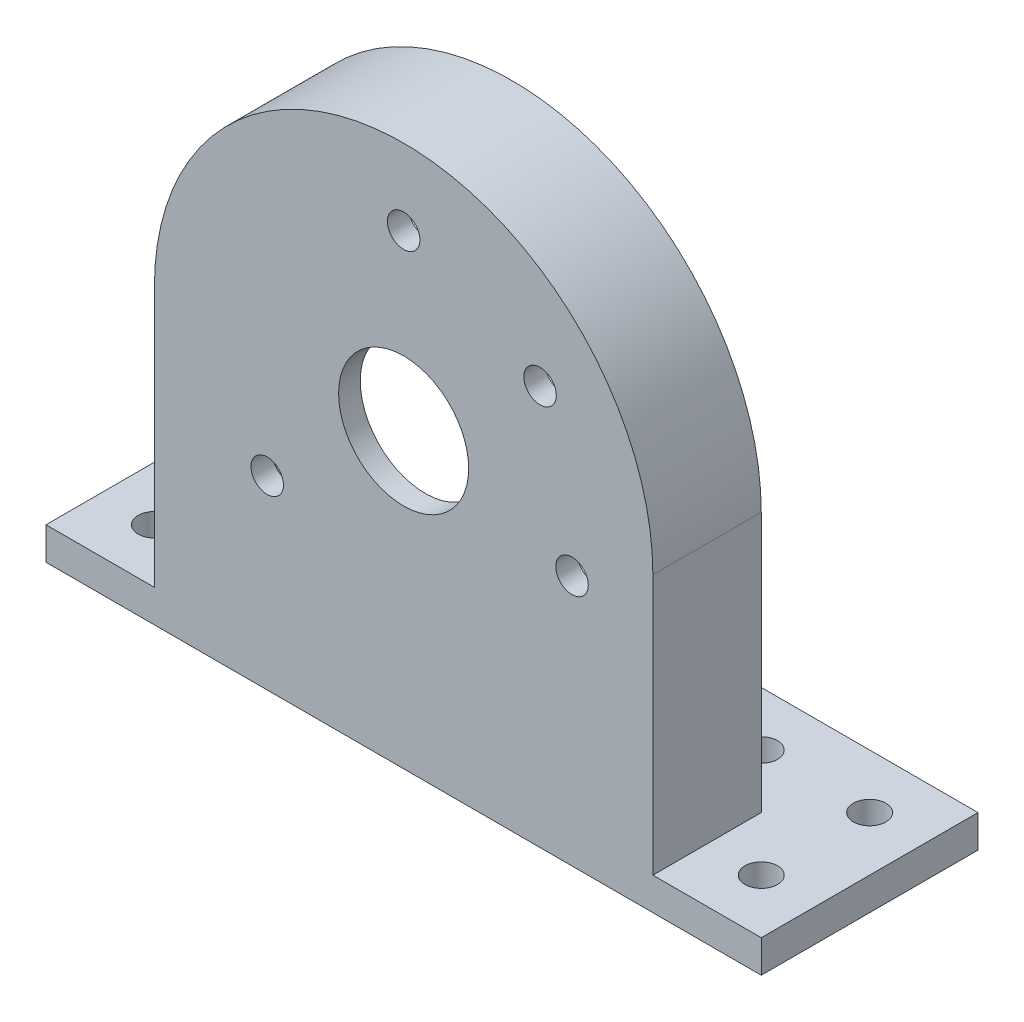
ISO-10303-21;
HEADER;
FILE_DESCRIPTION(('STEP AP214'),'2;1');
FILE_NAME('part.step','',(''),(''),'','','');
FILE_SCHEMA(('AUTOMOTIVE_DESIGN { 1 0 10303 214 1 1 1 1 }'));
ENDSEC;
DATA;
#1=APPLICATION_CONTEXT('core data for automotive mechanical design processes');
#2=APPLICATION_PROTOCOL_DEFINITION('international standard','automotive_design',2000,#1);
#3=PRODUCT_CONTEXT('',#1,'mechanical');
#4=PRODUCT('Part','Part','',(#3));
#5=PRODUCT_RELATED_PRODUCT_CATEGORY('part','',(#4));
#6=PRODUCT_DEFINITION_FORMATION('','',#4);
#7=PRODUCT_DEFINITION_CONTEXT('part definition',#1,'design');
#8=PRODUCT_DEFINITION('design','',#6,#7);
#9=PRODUCT_DEFINITION_SHAPE('','',#8);
#10=(LENGTH_UNIT() NAMED_UNIT(*) SI_UNIT(.MILLI.,.METRE.));
#11=(NAMED_UNIT(*) PLANE_ANGLE_UNIT() SI_UNIT($,.RADIAN.));
#12=(NAMED_UNIT(*) SI_UNIT($,.STERADIAN.) SOLID_ANGLE_UNIT());
#13=UNCERTAINTY_MEASURE_WITH_UNIT(LENGTH_MEASURE(1.E-05),#10,'distance_accuracy_value','');
#14=(GEOMETRIC_REPRESENTATION_CONTEXT(3) GLOBAL_UNCERTAINTY_ASSIGNED_CONTEXT((#13)) GLOBAL_UNIT_ASSIGNED_CONTEXT((#10,
#11,#12)) REPRESENTATION_CONTEXT('',''));
#15=CARTESIAN_POINT('',(0.,0.,0.));
#16=DIRECTION('',(0.,0.,1.));
#17=DIRECTION('',(1.,0.,0.));
#18=AXIS2_PLACEMENT_3D('',#15,#16,#17);
#19=CARTESIAN_POINT('',(-23.,0.,20.));
#20=DIRECTION('',(1.,0.,0.));
#21=DIRECTION('',(0.,1.,0.));
#22=AXIS2_PLACEMENT_3D('',#19,#20,#21);
#23=PLANE('',#22);
#24=DIRECTION('',(0.,0.,1.));
#25=VECTOR('',#24,1.);
#26=CARTESIAN_POINT('',(-23.,-24.,20.));
#27=LINE('',#26,#25);
#28=CARTESIAN_POINT('',(-23.,-24.,10.));
#29=VERTEX_POINT('',#28);
#30=CARTESIAN_POINT('',(-23.,-24.,20.));
#31=VERTEX_POINT('',#30);
#32=EDGE_CURVE('E54',#29,#31,#27,.T.);
#33=ORIENTED_EDGE('',*,*,#32,.T.);
#34=DIRECTION('',(0.,-1.,0.));
#35=VECTOR('',#34,1.);
#36=CARTESIAN_POINT('',(-23.,0.,20.));
#37=LINE('',#36,#35);
#38=CARTESIAN_POINT('',(-23.,0.,20.));
#39=VERTEX_POINT('',#38);
#40=EDGE_CURVE('E128',#39,#31,#37,.T.);
#41=ORIENTED_EDGE('',*,*,#40,.F.);
#42=DIRECTION('',(0.,0.,-1.));
#43=VECTOR('',#42,1.);
#44=CARTESIAN_POINT('',(-23.,0.,20.));
#45=LINE('',#44,#43);
#46=CARTESIAN_POINT('',(-23.,0.,10.));
#47=VERTEX_POINT('',#46);
#48=EDGE_CURVE('E11',#39,#47,#45,.T.);
#49=ORIENTED_EDGE('',*,*,#48,.T.);
#50=DIRECTION('',(0.,1.,0.));
#51=VECTOR('',#50,1.);
#52=CARTESIAN_POINT('',(-23.,-24.,10.));
#53=LINE('',#52,#51);
#54=EDGE_CURVE('E216',#29,#47,#53,.T.);
#55=ORIENTED_EDGE('',*,*,#54,.F.);
#56=EDGE_LOOP('',(#33,#41,#49,#55));
#57=FACE_BOUND('',#56,.T.);
#58=ADVANCED_FACE('F37',(#57),#23,.F.);
#59=CARTESIAN_POINT('',(23.,-27.,20.));
#60=DIRECTION('',(-1.,0.,0.));
#61=DIRECTION('',(0.,-1.,0.));
#62=AXIS2_PLACEMENT_3D('',#59,#60,#61);
#63=PLANE('',#62);
#64=DIRECTION('',(0.,0.,-1.));
#65=VECTOR('',#64,1.);
#66=CARTESIAN_POINT('',(23.,-24.,20.));
#67=LINE('',#66,#65);
#68=CARTESIAN_POINT('',(23.,-24.,20.));
#69=VERTEX_POINT('',#68);
#70=CARTESIAN_POINT('',(23.,-24.,10.));
#71=VERTEX_POINT('',#70);
#72=EDGE_CURVE('E151',#69,#71,#67,.T.);
#73=ORIENTED_EDGE('',*,*,#72,.T.);
#74=DIRECTION('',(0.,-1.,0.));
#75=VECTOR('',#74,1.);
#76=CARTESIAN_POINT('',(23.,0.,10.));
#77=LINE('',#76,#75);
#78=CARTESIAN_POINT('',(23.,0.,10.));
#79=VERTEX_POINT('',#78);
#80=EDGE_CURVE('E211',#79,#71,#77,.T.);
#81=ORIENTED_EDGE('',*,*,#80,.F.);
#82=DIRECTION('',(0.,0.,-1.));
#83=VECTOR('',#82,1.);
#84=CARTESIAN_POINT('',(23.,0.,20.));
#85=LINE('',#84,#83);
#86=CARTESIAN_POINT('',(23.,0.,20.));
#87=VERTEX_POINT('',#86);
#88=EDGE_CURVE('E46',#87,#79,#85,.T.);
#89=ORIENTED_EDGE('',*,*,#88,.F.);
#90=DIRECTION('',(0.,1.,0.));
#91=VECTOR('',#90,1.);
#92=CARTESIAN_POINT('',(23.,-27.,20.));
#93=LINE('',#92,#91);
#94=EDGE_CURVE('E62',#69,#87,#93,.T.);
#95=ORIENTED_EDGE('',*,*,#94,.F.);
#96=EDGE_LOOP('',(#73,#81,#89,#95));
#97=FACE_BOUND('',#96,.T.);
#98=ADVANCED_FACE('F276',(#97),#63,.F.);
#99=CARTESIAN_POINT('',(0.,0.,20.));
#100=DIRECTION('',(0.,0.,-1.));
#101=DIRECTION('',(-1.,0.,0.));
#102=AXIS2_PLACEMENT_3D('',#99,#100,#101);
#103=CYLINDRICAL_SURFACE('',#102,23.);
#104=CARTESIAN_POINT('',(0.,0.,10.));
#105=DIRECTION('',(0.,0.,-1.));
#106=DIRECTION('',(-1.,0.,0.));
#107=AXIS2_PLACEMENT_3D('',#104,#105,#106);
#108=CIRCLE('',#107,23.);
#109=EDGE_CURVE('E218',#47,#79,#108,.T.);
#110=ORIENTED_EDGE('',*,*,#109,.F.);
#111=ORIENTED_EDGE('',*,*,#48,.F.);
#112=CARTESIAN_POINT('',(0.,0.,20.));
#113=DIRECTION('',(0.,0.,1.));
#114=DIRECTION('',(1.,0.,0.));
#115=AXIS2_PLACEMENT_3D('',#112,#113,#114);
#116=CIRCLE('',#115,23.);
#117=EDGE_CURVE('E222',#87,#39,#116,.T.);
#118=ORIENTED_EDGE('',*,*,#117,.F.);
#119=ORIENTED_EDGE('',*,*,#88,.T.);
#120=EDGE_LOOP('',(#110,#111,#118,#119));
#121=FACE_BOUND('',#120,.T.);
#122=ADVANCED_FACE('F39',(#121),#103,.T.);
#123=CARTESIAN_POINT('',(-23.,-27.,20.));
#124=DIRECTION('',(0.,1.,0.));
#125=DIRECTION('',(0.,0.,1.));
#126=AXIS2_PLACEMENT_3D('',#123,#124,#125);
#127=PLANE('',#126);
#128=CARTESIAN_POINT('',(-18.,-27.,5.));
#129=DIRECTION('',(0.,-1.,0.));
#130=DIRECTION('',(0.,0.,1.));
#131=AXIS2_PLACEMENT_3D('',#128,#129,#130);
#132=CIRCLE('',#131,1.5);
#133=CARTESIAN_POINT('',(-18.,-27.,6.5));
#134=VERTEX_POINT('',#133);
#135=EDGE_CURVE('E195',#134,#134,#132,.T.);
#136=ORIENTED_EDGE('',*,*,#135,.F.);
#137=EDGE_LOOP('',(#136));
#138=FACE_BOUND('',#137,.T.);
#139=CARTESIAN_POINT('',(18.,-27.,5.));
#140=DIRECTION('',(0.,-1.,0.));
#141=DIRECTION('',(0.,0.,-1.));
#142=AXIS2_PLACEMENT_3D('',#139,#140,#141);
#143=CIRCLE('',#142,1.5);
#144=CARTESIAN_POINT('',(18.,-27.,3.5));
#145=VERTEX_POINT('',#144);
#146=EDGE_CURVE('E192',#145,#145,#143,.T.);
#147=ORIENTED_EDGE('',*,*,#146,.F.);
#148=EDGE_LOOP('',(#147));
#149=FACE_BOUND('',#148,.T.);
#150=CARTESIAN_POINT('',(18.,-27.,15.));
#151=DIRECTION('',(0.,-1.,0.));
#152=DIRECTION('',(0.,0.,1.));
#153=AXIS2_PLACEMENT_3D('',#150,#151,#152);
#154=CIRCLE('',#153,1.5);
#155=CARTESIAN_POINT('',(18.,-27.,16.5));
#156=VERTEX_POINT('',#155);
#157=EDGE_CURVE('E189',#156,#156,#154,.T.);
#158=ORIENTED_EDGE('',*,*,#157,.F.);
#159=EDGE_LOOP('',(#158));
#160=FACE_BOUND('',#159,.T.);
#161=CARTESIAN_POINT('',(-18.,-27.,15.));
#162=DIRECTION('',(0.,-1.,0.));
#163=DIRECTION('',(0.,0.,-1.));
#164=AXIS2_PLACEMENT_3D('',#161,#162,#163);
#165=CIRCLE('',#164,1.5);
#166=CARTESIAN_POINT('',(-18.,-27.,13.5));
#167=VERTEX_POINT('',#166);
#168=EDGE_CURVE('E188',#167,#167,#165,.T.);
#169=ORIENTED_EDGE('',*,*,#168,.F.);
#170=EDGE_LOOP('',(#169));
#171=FACE_BOUND('',#170,.T.);
#172=DIRECTION('',(1.,0.,0.));
#173=VECTOR('',#172,1.);
#174=CARTESIAN_POINT('',(-23.,-27.,0.));
#175=LINE('',#174,#173);
#176=CARTESIAN_POINT('',(-33.,-27.,0.));
#177=VERTEX_POINT('',#176);
#178=CARTESIAN_POINT('',(33.,-27.,0.));
#179=VERTEX_POINT('',#178);
#180=EDGE_CURVE('E220',#177,#179,#175,.T.);
#181=ORIENTED_EDGE('',*,*,#180,.T.);
#182=DIRECTION('',(0.,0.,1.));
#183=VECTOR('',#182,1.);
#184=CARTESIAN_POINT('',(33.,-27.,20.));
#185=LINE('',#184,#183);
#186=CARTESIAN_POINT('',(33.,-27.,20.));
#187=VERTEX_POINT('',#186);
#188=EDGE_CURVE('E148',#179,#187,#185,.T.);
#189=ORIENTED_EDGE('',*,*,#188,.T.);
#190=DIRECTION('',(1.,0.,0.));
#191=VECTOR('',#190,1.);
#192=CARTESIAN_POINT('',(-23.,-27.,20.));
#193=LINE('',#192,#191);
#194=CARTESIAN_POINT('',(-33.,-27.,20.));
#195=VERTEX_POINT('',#194);
#196=EDGE_CURVE('E225',#195,#187,#193,.T.);
#197=ORIENTED_EDGE('',*,*,#196,.F.);
#198=DIRECTION('',(0.,0.,-1.));
#199=VECTOR('',#198,1.);
#200=CARTESIAN_POINT('',(-33.,-27.,20.));
#201=LINE('',#200,#199);
#202=EDGE_CURVE('E114',#195,#177,#201,.T.);
#203=ORIENTED_EDGE('',*,*,#202,.T.);
#204=EDGE_LOOP('',(#181,#189,#197,#203));
#205=FACE_BOUND('',#204,.T.);
#206=CARTESIAN_POINT('',(28.,-27.,5.));
#207=DIRECTION('',(0.,-1.,0.));
#208=DIRECTION('',(0.,0.,-1.));
#209=AXIS2_PLACEMENT_3D('',#206,#207,#208);
#210=CIRCLE('',#209,1.5);
#211=CARTESIAN_POINT('',(28.,-27.,3.5));
#212=VERTEX_POINT('',#211);
#213=EDGE_CURVE('E137',#212,#212,#210,.T.);
#214=ORIENTED_EDGE('',*,*,#213,.F.);
#215=EDGE_LOOP('',(#214));
#216=FACE_BOUND('',#215,.T.);
#217=CARTESIAN_POINT('',(28.,-27.,15.));
#218=DIRECTION('',(0.,-1.,0.));
#219=DIRECTION('',(0.,0.,-1.));
#220=AXIS2_PLACEMENT_3D('',#217,#218,#219);
#221=CIRCLE('',#220,1.5);
#222=CARTESIAN_POINT('',(28.,-27.,13.5));
#223=VERTEX_POINT('',#222);
#224=EDGE_CURVE('E142',#223,#223,#221,.T.);
#225=ORIENTED_EDGE('',*,*,#224,.F.);
#226=EDGE_LOOP('',(#225));
#227=FACE_BOUND('',#226,.T.);
#228=CARTESIAN_POINT('',(-28.,-27.,5.));
#229=DIRECTION('',(0.,-1.,0.));
#230=DIRECTION('',(0.,0.,1.));
#231=AXIS2_PLACEMENT_3D('',#228,#229,#230);
#232=CIRCLE('',#231,1.5);
#233=CARTESIAN_POINT('',(-28.,-27.,6.5));
#234=VERTEX_POINT('',#233);
#235=EDGE_CURVE('E300',#234,#234,#232,.T.);
#236=ORIENTED_EDGE('',*,*,#235,.F.);
#237=EDGE_LOOP('',(#236));
#238=FACE_BOUND('',#237,.T.);
#239=CARTESIAN_POINT('',(-28.,-27.,15.));
#240=DIRECTION('',(0.,-1.,0.));
#241=DIRECTION('',(0.,0.,1.));
#242=AXIS2_PLACEMENT_3D('',#239,#240,#241);
#243=CIRCLE('',#242,1.5);
#244=CARTESIAN_POINT('',(-28.,-27.,16.5));
#245=VERTEX_POINT('',#244);
#246=EDGE_CURVE('E133',#245,#245,#243,.T.);
#247=ORIENTED_EDGE('',*,*,#246,.F.);
#248=EDGE_LOOP('',(#247));
#249=FACE_BOUND('',#248,.T.);
#250=ADVANCED_FACE('F288',(#138,#149,#160,#171,#205,#216,#227,#238,#249),#127,.F.);
#251=CARTESIAN_POINT('',(0.,0.,20.));
#252=DIRECTION('',(0.,0.,1.));
#253=DIRECTION('',(1.,0.,0.));
#254=AXIS2_PLACEMENT_3D('',#251,#252,#253);
#255=PLANE('',#254);
#256=CARTESIAN_POINT('',(0.,0.,20.));
#257=DIRECTION('',(0.,0.,1.));
#258=DIRECTION('',(1.,0.,0.));
#259=AXIS2_PLACEMENT_3D('',#256,#257,#258);
#260=CIRCLE('',#259,6.);
#261=CARTESIAN_POINT('',(6.,0.,20.));
#262=VERTEX_POINT('',#261);
#263=EDGE_CURVE('E169',#262,#262,#260,.T.);
#264=ORIENTED_EDGE('',*,*,#263,.F.);
#265=EDGE_LOOP('',(#264));
#266=FACE_BOUND('',#265,.T.);
#267=CARTESIAN_POINT('',(0.,16.,20.));
#268=DIRECTION('',(0.,0.,1.));
#269=DIRECTION('',(1.,0.,0.));
#270=AXIS2_PLACEMENT_3D('',#267,#268,#269);
#271=CIRCLE('',#270,1.5);
#272=CARTESIAN_POINT('',(1.5,16.,20.));
#273=VERTEX_POINT('',#272);
#274=EDGE_CURVE('E173',#273,#273,#271,.T.);
#275=ORIENTED_EDGE('',*,*,#274,.F.);
#276=EDGE_LOOP('',(#275));
#277=FACE_BOUND('',#276,.T.);
#278=CARTESIAN_POINT('',(15.5396181585465,-3.810546875,20.));
#279=DIRECTION('',(0.,0.,1.));
#280=DIRECTION('',(1.,0.,0.));
#281=AXIS2_PLACEMENT_3D('',#278,#279,#280);
#282=CIRCLE('',#281,1.5);
#283=CARTESIAN_POINT('',(17.0396181585465,-3.810546875,20.));
#284=VERTEX_POINT('',#283);
#285=EDGE_CURVE('E172',#284,#284,#282,.T.);
#286=ORIENTED_EDGE('',*,*,#285,.F.);
#287=EDGE_LOOP('',(#286));
#288=FACE_BOUND('',#287,.T.);
#289=CARTESIAN_POINT('',(-12.589057748696,-9.87499999999991,20.));
#290=DIRECTION('',(0.,0.,1.));
#291=DIRECTION('',(1.,0.,0.));
#292=AXIS2_PLACEMENT_3D('',#289,#290,#291);
#293=CIRCLE('',#292,1.5);
#294=CARTESIAN_POINT('',(-11.089057748696,-9.87499999999991,20.));
#295=VERTEX_POINT('',#294);
#296=EDGE_CURVE('E180',#295,#295,#293,.T.);
#297=ORIENTED_EDGE('',*,*,#296,.F.);
#298=EDGE_LOOP('',(#297));
#299=FACE_BOUND('',#298,.T.);
#300=CARTESIAN_POINT('',(12.5890577486959,9.875,20.));
#301=DIRECTION('',(0.,0.,1.));
#302=DIRECTION('',(1.,0.,0.));
#303=AXIS2_PLACEMENT_3D('',#300,#301,#302);
#304=CIRCLE('',#303,1.5);
#305=CARTESIAN_POINT('',(14.0890577486959,9.875,20.));
#306=VERTEX_POINT('',#305);
#307=EDGE_CURVE('E177',#306,#306,#304,.T.);
#308=ORIENTED_EDGE('',*,*,#307,.F.);
#309=EDGE_LOOP('',(#308));
#310=FACE_BOUND('',#309,.T.);
#311=ORIENTED_EDGE('',*,*,#117,.T.);
#312=ORIENTED_EDGE('',*,*,#40,.T.);
#313=DIRECTION('',(-1.,0.,0.));
#314=VECTOR('',#313,1.);
#315=CARTESIAN_POINT('',(-23.,-24.,20.));
#316=LINE('',#315,#314);
#317=CARTESIAN_POINT('',(-33.,-24.,20.));
#318=VERTEX_POINT('',#317);
#319=EDGE_CURVE('E122',#31,#318,#316,.T.);
#320=ORIENTED_EDGE('',*,*,#319,.T.);
#321=DIRECTION('',(0.,-1.,0.));
#322=VECTOR('',#321,1.);
#323=CARTESIAN_POINT('',(-33.,-24.,20.));
#324=LINE('',#323,#322);
#325=EDGE_CURVE('E108',#318,#195,#324,.T.);
#326=ORIENTED_EDGE('',*,*,#325,.T.);
#327=ORIENTED_EDGE('',*,*,#196,.T.);
#328=DIRECTION('',(0.,-1.,0.));
#329=VECTOR('',#328,1.);
#330=CARTESIAN_POINT('',(33.,-24.,20.));
#331=LINE('',#330,#329);
#332=CARTESIAN_POINT('',(33.,-24.,20.));
#333=VERTEX_POINT('',#332);
#334=EDGE_CURVE('E161',#333,#187,#331,.T.);
#335=ORIENTED_EDGE('',*,*,#334,.F.);
#336=DIRECTION('',(-1.,0.,0.));
#337=VECTOR('',#336,1.);
#338=CARTESIAN_POINT('',(23.,-24.,20.));
#339=LINE('',#338,#337);
#340=EDGE_CURVE('E156',#333,#69,#339,.T.);
#341=ORIENTED_EDGE('',*,*,#340,.T.);
#342=ORIENTED_EDGE('',*,*,#94,.T.);
#343=EDGE_LOOP('',(#311,#312,#320,#326,#327,#335,#341,#342));
#344=FACE_BOUND('',#343,.T.);
#345=ADVANCED_FACE('F127',(#266,#277,#288,#299,#310,#344),#255,.T.);
#346=CARTESIAN_POINT('',(0.,0.,0.));
#347=DIRECTION('',(0.,0.,1.));
#348=DIRECTION('',(1.,0.,0.));
#349=AXIS2_PLACEMENT_3D('',#346,#347,#348);
#350=PLANE('',#349);
#351=ORIENTED_EDGE('',*,*,#180,.F.);
#352=DIRECTION('',(0.,-1.,0.));
#353=VECTOR('',#352,1.);
#354=CARTESIAN_POINT('',(-33.,-24.,0.));
#355=LINE('',#354,#353);
#356=CARTESIAN_POINT('',(-33.,-24.,0.));
#357=VERTEX_POINT('',#356);
#358=EDGE_CURVE('E116',#357,#177,#355,.T.);
#359=ORIENTED_EDGE('',*,*,#358,.F.);
#360=DIRECTION('',(-1.,0.,0.));
#361=VECTOR('',#360,1.);
#362=CARTESIAN_POINT('',(23.,-24.,0.));
#363=LINE('',#362,#361);
#364=CARTESIAN_POINT('',(33.,-24.,0.));
#365=VERTEX_POINT('',#364);
#366=EDGE_CURVE('E124',#365,#357,#363,.T.);
#367=ORIENTED_EDGE('',*,*,#366,.F.);
#368=DIRECTION('',(0.,-1.,0.));
#369=VECTOR('',#368,1.);
#370=CARTESIAN_POINT('',(33.,-24.,0.));
#371=LINE('',#370,#369);
#372=EDGE_CURVE('E158',#365,#179,#371,.T.);
#373=ORIENTED_EDGE('',*,*,#372,.T.);
#374=EDGE_LOOP('',(#351,#359,#367,#373));
#375=FACE_BOUND('',#374,.T.);
#376=ADVANCED_FACE('F286',(#375),#350,.F.);
#377=CARTESIAN_POINT('',(23.,-24.,10.));
#378=DIRECTION('',(0.,-1.,0.));
#379=DIRECTION('',(0.,0.,-1.));
#380=AXIS2_PLACEMENT_3D('',#377,#378,#379);
#381=PLANE('',#380);
#382=CARTESIAN_POINT('',(-18.,-24.,5.));
#383=DIRECTION('',(0.,-1.,0.));
#384=DIRECTION('',(0.,0.,-1.));
#385=AXIS2_PLACEMENT_3D('',#382,#383,#384);
#386=CIRCLE('',#385,1.5);
#387=CARTESIAN_POINT('',(-18.,-24.,3.5));
#388=VERTEX_POINT('',#387);
#389=EDGE_CURVE('E210',#388,#388,#386,.T.);
#390=ORIENTED_EDGE('',*,*,#389,.T.);
#391=EDGE_LOOP('',(#390));
#392=FACE_BOUND('',#391,.T.);
#393=CARTESIAN_POINT('',(18.,-24.,5.));
#394=DIRECTION('',(0.,-1.,0.));
#395=DIRECTION('',(0.,0.,-1.));
#396=AXIS2_PLACEMENT_3D('',#393,#394,#395);
#397=CIRCLE('',#396,1.5);
#398=CARTESIAN_POINT('',(18.,-24.,3.5));
#399=VERTEX_POINT('',#398);
#400=EDGE_CURVE('E201',#399,#399,#397,.T.);
#401=ORIENTED_EDGE('',*,*,#400,.T.);
#402=EDGE_LOOP('',(#401));
#403=FACE_BOUND('',#402,.T.);
#404=ORIENTED_EDGE('',*,*,#366,.T.);
#405=DIRECTION('',(0.,0.,-1.));
#406=VECTOR('',#405,1.);
#407=CARTESIAN_POINT('',(-33.,-24.,20.));
#408=LINE('',#407,#406);
#409=EDGE_CURVE('E112',#318,#357,#408,.T.);
#410=ORIENTED_EDGE('',*,*,#409,.F.);
#411=ORIENTED_EDGE('',*,*,#319,.F.);
#412=ORIENTED_EDGE('',*,*,#32,.F.);
#413=DIRECTION('',(-1.,0.,0.));
#414=VECTOR('',#413,1.);
#415=CARTESIAN_POINT('',(23.,-24.,10.));
#416=LINE('',#415,#414);
#417=EDGE_CURVE('E214',#71,#29,#416,.T.);
#418=ORIENTED_EDGE('',*,*,#417,.F.);
#419=ORIENTED_EDGE('',*,*,#72,.F.);
#420=ORIENTED_EDGE('',*,*,#340,.F.);
#421=DIRECTION('',(0.,0.,1.));
#422=VECTOR('',#421,1.);
#423=CARTESIAN_POINT('',(33.,-24.,20.));
#424=LINE('',#423,#422);
#425=EDGE_CURVE('E153',#365,#333,#424,.T.);
#426=ORIENTED_EDGE('',*,*,#425,.F.);
#427=EDGE_LOOP('',(#404,#410,#411,#412,#418,#419,#420,#426));
#428=FACE_BOUND('',#427,.T.);
#429=CARTESIAN_POINT('',(28.,-24.,5.));
#430=DIRECTION('',(0.,-1.,0.));
#431=DIRECTION('',(0.,0.,-1.));
#432=AXIS2_PLACEMENT_3D('',#429,#430,#431);
#433=CIRCLE('',#432,1.5);
#434=CARTESIAN_POINT('',(28.,-24.,3.5));
#435=VERTEX_POINT('',#434);
#436=EDGE_CURVE('E139',#435,#435,#433,.T.);
#437=ORIENTED_EDGE('',*,*,#436,.T.);
#438=EDGE_LOOP('',(#437));
#439=FACE_BOUND('',#438,.T.);
#440=CARTESIAN_POINT('',(28.,-24.,15.));
#441=DIRECTION('',(0.,-1.,0.));
#442=DIRECTION('',(0.,0.,-1.));
#443=AXIS2_PLACEMENT_3D('',#440,#441,#442);
#444=CIRCLE('',#443,1.5);
#445=CARTESIAN_POINT('',(28.,-24.,13.5));
#446=VERTEX_POINT('',#445);
#447=EDGE_CURVE('E145',#446,#446,#444,.T.);
#448=ORIENTED_EDGE('',*,*,#447,.T.);
#449=EDGE_LOOP('',(#448));
#450=FACE_BOUND('',#449,.T.);
#451=CARTESIAN_POINT('',(-28.,-24.,5.));
#452=DIRECTION('',(0.,-1.,0.));
#453=DIRECTION('',(0.,0.,1.));
#454=AXIS2_PLACEMENT_3D('',#451,#452,#453);
#455=CIRCLE('',#454,1.5);
#456=CARTESIAN_POINT('',(-28.,-24.,6.5));
#457=VERTEX_POINT('',#456);
#458=EDGE_CURVE('E304',#457,#457,#455,.T.);
#459=ORIENTED_EDGE('',*,*,#458,.T.);
#460=EDGE_LOOP('',(#459));
#461=FACE_BOUND('',#460,.T.);
#462=CARTESIAN_POINT('',(-28.,-24.,15.));
#463=DIRECTION('',(0.,-1.,0.));
#464=DIRECTION('',(0.,0.,1.));
#465=AXIS2_PLACEMENT_3D('',#462,#463,#464);
#466=CIRCLE('',#465,1.5);
#467=CARTESIAN_POINT('',(-28.,-24.,16.5));
#468=VERTEX_POINT('',#467);
#469=EDGE_CURVE('E130',#468,#468,#466,.T.);
#470=ORIENTED_EDGE('',*,*,#469,.T.);
#471=EDGE_LOOP('',(#470));
#472=FACE_BOUND('',#471,.T.);
#473=ADVANCED_FACE('F120',(#392,#403,#428,#439,#450,#461,#472),#381,.F.);
#474=CARTESIAN_POINT('',(0.,0.,10.));
#475=DIRECTION('',(0.,0.,-1.));
#476=DIRECTION('',(-1.,0.,0.));
#477=AXIS2_PLACEMENT_3D('',#474,#475,#476);
#478=PLANE('',#477);
#479=CARTESIAN_POINT('',(0.,0.,10.));
#480=DIRECTION('',(0.,0.,-1.));
#481=DIRECTION('',(-1.,0.,0.));
#482=AXIS2_PLACEMENT_3D('',#479,#480,#481);
#483=CIRCLE('',#482,21.);
#484=CARTESIAN_POINT('',(-21.,0.,10.));
#485=VERTEX_POINT('',#484);
#486=EDGE_CURVE('E207',#485,#485,#483,.T.);
#487=ORIENTED_EDGE('',*,*,#486,.F.);
#488=EDGE_LOOP('',(#487));
#489=FACE_BOUND('',#488,.T.);
#490=ORIENTED_EDGE('',*,*,#80,.T.);
#491=ORIENTED_EDGE('',*,*,#417,.T.);
#492=ORIENTED_EDGE('',*,*,#54,.T.);
#493=ORIENTED_EDGE('',*,*,#109,.T.);
#494=EDGE_LOOP('',(#490,#491,#492,#493));
#495=FACE_BOUND('',#494,.T.);
#496=ADVANCED_FACE('F265',(#489,#495),#478,.T.);
#497=CARTESIAN_POINT('',(0.,0.,18.));
#498=DIRECTION('',(0.,0.,-1.));
#499=DIRECTION('',(-1.,0.,0.));
#500=AXIS2_PLACEMENT_3D('',#497,#498,#499);
#501=CYLINDRICAL_SURFACE('',#500,21.);
#502=CARTESIAN_POINT('',(0.,0.,18.));
#503=DIRECTION('',(0.,0.,-1.));
#504=DIRECTION('',(-1.,0.,0.));
#505=AXIS2_PLACEMENT_3D('',#502,#503,#504);
#506=CIRCLE('',#505,21.);
#507=CARTESIAN_POINT('',(-21.,0.,18.));
#508=VERTEX_POINT('',#507);
#509=EDGE_CURVE('E204',#508,#508,#506,.T.);
#510=ORIENTED_EDGE('',*,*,#509,.F.);
#511=EDGE_LOOP('',(#510));
#512=FACE_BOUND('',#511,.T.);
#513=ORIENTED_EDGE('',*,*,#486,.T.);
#514=EDGE_LOOP('',(#513));
#515=FACE_BOUND('',#514,.T.);
#516=ADVANCED_FACE('F253',(#512,#515),#501,.F.);
#517=CARTESIAN_POINT('',(0.,0.,18.));
#518=DIRECTION('',(0.,0.,-1.));
#519=DIRECTION('',(-1.,0.,0.));
#520=AXIS2_PLACEMENT_3D('',#517,#518,#519);
#521=PLANE('',#520);
#522=CARTESIAN_POINT('',(0.,0.,18.));
#523=DIRECTION('',(0.,0.,-1.));
#524=DIRECTION('',(-1.,0.,0.));
#525=AXIS2_PLACEMENT_3D('',#522,#523,#524);
#526=CIRCLE('',#525,6.);
#527=CARTESIAN_POINT('',(-6.,0.,18.));
#528=VERTEX_POINT('',#527);
#529=EDGE_CURVE('E164',#528,#528,#526,.T.);
#530=ORIENTED_EDGE('',*,*,#529,.F.);
#531=EDGE_LOOP('',(#530));
#532=FACE_BOUND('',#531,.T.);
#533=CARTESIAN_POINT('',(0.,16.,18.));
#534=DIRECTION('',(0.,0.,-1.));
#535=DIRECTION('',(-1.,0.,0.));
#536=AXIS2_PLACEMENT_3D('',#533,#534,#535);
#537=CIRCLE('',#536,1.5);
#538=CARTESIAN_POINT('',(-1.5,16.,18.));
#539=VERTEX_POINT('',#538);
#540=EDGE_CURVE('E41',#539,#539,#537,.T.);
#541=ORIENTED_EDGE('',*,*,#540,.F.);
#542=EDGE_LOOP('',(#541));
#543=FACE_BOUND('',#542,.T.);
#544=CARTESIAN_POINT('',(15.5396181585465,-3.810546875,18.));
#545=DIRECTION('',(0.,0.,-1.));
#546=DIRECTION('',(-1.,0.,0.));
#547=AXIS2_PLACEMENT_3D('',#544,#545,#546);
#548=CIRCLE('',#547,1.5);
#549=CARTESIAN_POINT('',(14.0396181585465,-3.810546875,18.));
#550=VERTEX_POINT('',#549);
#551=EDGE_CURVE('E239',#550,#550,#548,.T.);
#552=ORIENTED_EDGE('',*,*,#551,.F.);
#553=EDGE_LOOP('',(#552));
#554=FACE_BOUND('',#553,.T.);
#555=CARTESIAN_POINT('',(-12.589057748696,-9.87499999999991,18.));
#556=DIRECTION('',(0.,0.,-1.));
#557=DIRECTION('',(-1.,0.,0.));
#558=AXIS2_PLACEMENT_3D('',#555,#556,#557);
#559=CIRCLE('',#558,1.5);
#560=CARTESIAN_POINT('',(-14.089057748696,-9.87499999999991,18.));
#561=VERTEX_POINT('',#560);
#562=EDGE_CURVE('E237',#561,#561,#559,.T.);
#563=ORIENTED_EDGE('',*,*,#562,.F.);
#564=EDGE_LOOP('',(#563));
#565=FACE_BOUND('',#564,.T.);
#566=CARTESIAN_POINT('',(12.5890577486959,9.875,18.));
#567=DIRECTION('',(0.,0.,-1.));
#568=DIRECTION('',(-1.,0.,0.));
#569=AXIS2_PLACEMENT_3D('',#566,#567,#568);
#570=CIRCLE('',#569,1.5);
#571=CARTESIAN_POINT('',(11.0890577486959,9.875,18.));
#572=VERTEX_POINT('',#571);
#573=EDGE_CURVE('E176',#572,#572,#570,.T.);
#574=ORIENTED_EDGE('',*,*,#573,.F.);
#575=EDGE_LOOP('',(#574));
#576=FACE_BOUND('',#575,.T.);
#577=ORIENTED_EDGE('',*,*,#509,.T.);
#578=EDGE_LOOP('',(#577));
#579=FACE_BOUND('',#578,.T.);
#580=ADVANCED_FACE('F249',(#532,#543,#554,#565,#576,#579),#521,.T.);
#581=CARTESIAN_POINT('',(18.,-22.,5.));
#582=DIRECTION('',(0.,-1.,0.));
#583=DIRECTION('',(0.,0.,-1.));
#584=AXIS2_PLACEMENT_3D('',#581,#582,#583);
#585=CYLINDRICAL_SURFACE('',#584,1.5);
#586=ORIENTED_EDGE('',*,*,#146,.T.);
#587=EDGE_LOOP('',(#586));
#588=FACE_BOUND('',#587,.T.);
#589=ORIENTED_EDGE('',*,*,#400,.F.);
#590=EDGE_LOOP('',(#589));
#591=FACE_BOUND('',#590,.T.);
#592=ADVANCED_FACE('F252',(#588,#591),#585,.F.);
#593=CARTESIAN_POINT('',(-18.,-22.,5.));
#594=DIRECTION('',(0.,-1.,0.));
#595=DIRECTION('',(0.,0.,-1.));
#596=AXIS2_PLACEMENT_3D('',#593,#594,#595);
#597=CYLINDRICAL_SURFACE('',#596,1.5);
#598=ORIENTED_EDGE('',*,*,#135,.T.);
#599=EDGE_LOOP('',(#598));
#600=FACE_BOUND('',#599,.T.);
#601=ORIENTED_EDGE('',*,*,#389,.F.);
#602=EDGE_LOOP('',(#601));
#603=FACE_BOUND('',#602,.T.);
#604=ADVANCED_FACE('F341',(#600,#603),#597,.F.);
#605=CARTESIAN_POINT('',(-18.,-22.,15.));
#606=DIRECTION('',(0.,-1.,0.));
#607=DIRECTION('',(0.,0.,-1.));
#608=AXIS2_PLACEMENT_3D('',#605,#606,#607);
#609=CYLINDRICAL_SURFACE('',#608,1.5);
#610=CARTESIAN_POINT('',(-18.,-22.,15.));
#611=DIRECTION('',(0.,-1.,0.));
#612=DIRECTION('',(0.,0.,-1.));
#613=AXIS2_PLACEMENT_3D('',#610,#611,#612);
#614=CIRCLE('',#613,1.5);
#615=CARTESIAN_POINT('',(-18.,-22.,13.5));
#616=VERTEX_POINT('',#615);
#617=EDGE_CURVE('E198',#616,#616,#614,.T.);
#618=ORIENTED_EDGE('',*,*,#617,.F.);
#619=EDGE_LOOP('',(#618));
#620=FACE_BOUND('',#619,.T.);
#621=ORIENTED_EDGE('',*,*,#168,.T.);
#622=EDGE_LOOP('',(#621));
#623=FACE_BOUND('',#622,.T.);
#624=ADVANCED_FACE('F337',(#620,#623),#609,.F.);
#625=CARTESIAN_POINT('',(-18.,-22.,15.));
#626=DIRECTION('',(0.,-1.,0.));
#627=DIRECTION('',(0.,0.,-1.));
#628=AXIS2_PLACEMENT_3D('',#625,#626,#627);
#629=PLANE('',#628);
#630=ORIENTED_EDGE('',*,*,#617,.T.);
#631=EDGE_LOOP('',(#630));
#632=FACE_BOUND('',#631,.T.);
#633=ADVANCED_FACE('F340',(#632),#629,.T.);
#634=CARTESIAN_POINT('',(18.,-22.,15.));
#635=DIRECTION('',(0.,-1.,0.));
#636=DIRECTION('',(0.,0.,-1.));
#637=AXIS2_PLACEMENT_3D('',#634,#635,#636);
#638=CYLINDRICAL_SURFACE('',#637,1.5);
#639=CARTESIAN_POINT('',(18.,-22.,15.));
#640=DIRECTION('',(0.,-1.,0.));
#641=DIRECTION('',(0.,0.,1.));
#642=AXIS2_PLACEMENT_3D('',#639,#640,#641);
#643=CIRCLE('',#642,1.5);
#644=CARTESIAN_POINT('',(18.,-22.,16.5));
#645=VERTEX_POINT('',#644);
#646=EDGE_CURVE('E185',#645,#645,#643,.T.);
#647=ORIENTED_EDGE('',*,*,#646,.F.);
#648=EDGE_LOOP('',(#647));
#649=FACE_BOUND('',#648,.T.);
#650=ORIENTED_EDGE('',*,*,#157,.T.);
#651=EDGE_LOOP('',(#650));
#652=FACE_BOUND('',#651,.T.);
#653=ADVANCED_FACE('F345',(#649,#652),#638,.F.);
#654=CARTESIAN_POINT('',(18.,-22.,15.));
#655=DIRECTION('',(0.,1.,0.));
#656=DIRECTION('',(0.,0.,1.));
#657=AXIS2_PLACEMENT_3D('',#654,#655,#656);
#658=PLANE('',#657);
#659=ORIENTED_EDGE('',*,*,#646,.T.);
#660=EDGE_LOOP('',(#659));
#661=FACE_BOUND('',#660,.T.);
#662=ADVANCED_FACE('F355',(#661),#658,.F.);
#663=CARTESIAN_POINT('',(12.5890577486959,9.875,17.));
#664=DIRECTION('',(0.,0.,1.));
#665=DIRECTION('',(1.,0.,0.));
#666=AXIS2_PLACEMENT_3D('',#663,#664,#665);
#667=CYLINDRICAL_SURFACE('',#666,1.5);
#668=ORIENTED_EDGE('',*,*,#573,.T.);
#669=EDGE_LOOP('',(#668));
#670=FACE_BOUND('',#669,.T.);
#671=ORIENTED_EDGE('',*,*,#307,.T.);
#672=EDGE_LOOP('',(#671));
#673=FACE_BOUND('',#672,.T.);
#674=ADVANCED_FACE('F359',(#670,#673),#667,.F.);
#675=CARTESIAN_POINT('',(-12.589057748696,-9.87499999999991,17.));
#676=DIRECTION('',(0.,0.,1.));
#677=DIRECTION('',(1.,0.,0.));
#678=AXIS2_PLACEMENT_3D('',#675,#676,#677);
#679=CYLINDRICAL_SURFACE('',#678,1.5);
#680=ORIENTED_EDGE('',*,*,#562,.T.);
#681=EDGE_LOOP('',(#680));
#682=FACE_BOUND('',#681,.T.);
#683=ORIENTED_EDGE('',*,*,#296,.T.);
#684=EDGE_LOOP('',(#683));
#685=FACE_BOUND('',#684,.T.);
#686=ADVANCED_FACE('F361',(#682,#685),#679,.F.);
#687=CARTESIAN_POINT('',(15.5396181585465,-3.810546875,17.));
#688=DIRECTION('',(0.,0.,1.));
#689=DIRECTION('',(1.,0.,0.));
#690=AXIS2_PLACEMENT_3D('',#687,#688,#689);
#691=CYLINDRICAL_SURFACE('',#690,1.5);
#692=ORIENTED_EDGE('',*,*,#551,.T.);
#693=EDGE_LOOP('',(#692));
#694=FACE_BOUND('',#693,.T.);
#695=ORIENTED_EDGE('',*,*,#285,.T.);
#696=EDGE_LOOP('',(#695));
#697=FACE_BOUND('',#696,.T.);
#698=ADVANCED_FACE('F364',(#694,#697),#691,.F.);
#699=CARTESIAN_POINT('',(0.,16.,17.));
#700=DIRECTION('',(0.,0.,1.));
#701=DIRECTION('',(1.,0.,0.));
#702=AXIS2_PLACEMENT_3D('',#699,#700,#701);
#703=CYLINDRICAL_SURFACE('',#702,1.5);
#704=ORIENTED_EDGE('',*,*,#540,.T.);
#705=EDGE_LOOP('',(#704));
#706=FACE_BOUND('',#705,.T.);
#707=ORIENTED_EDGE('',*,*,#274,.T.);
#708=EDGE_LOOP('',(#707));
#709=FACE_BOUND('',#708,.T.);
#710=ADVANCED_FACE('F246',(#706,#709),#703,.F.);
#711=CARTESIAN_POINT('',(0.,0.,21.));
#712=DIRECTION('',(0.,0.,-1.));
#713=DIRECTION('',(-1.,0.,0.));
#714=AXIS2_PLACEMENT_3D('',#711,#712,#713);
#715=CYLINDRICAL_SURFACE('',#714,6.);
#716=ORIENTED_EDGE('',*,*,#263,.T.);
#717=EDGE_LOOP('',(#716));
#718=FACE_BOUND('',#717,.T.);
#719=ORIENTED_EDGE('',*,*,#529,.T.);
#720=EDGE_LOOP('',(#719));
#721=FACE_BOUND('',#720,.T.);
#722=ADVANCED_FACE('F373',(#718,#721),#715,.F.);
#723=CARTESIAN_POINT('',(33.,-24.,20.));
#724=DIRECTION('',(1.,0.,0.));
#725=DIRECTION('',(0.,0.,-1.));
#726=AXIS2_PLACEMENT_3D('',#723,#724,#725);
#727=PLANE('',#726);
#728=ORIENTED_EDGE('',*,*,#188,.F.);
#729=ORIENTED_EDGE('',*,*,#372,.F.);
#730=ORIENTED_EDGE('',*,*,#425,.T.);
#731=ORIENTED_EDGE('',*,*,#334,.T.);
#732=EDGE_LOOP('',(#728,#729,#730,#731));
#733=FACE_BOUND('',#732,.T.);
#734=ADVANCED_FACE('F284',(#733),#727,.T.);
#735=CARTESIAN_POINT('',(28.,-24.,15.));
#736=DIRECTION('',(0.,-1.,0.));
#737=DIRECTION('',(0.,0.,-1.));
#738=AXIS2_PLACEMENT_3D('',#735,#736,#737);
#739=CYLINDRICAL_SURFACE('',#738,1.5);
#740=ORIENTED_EDGE('',*,*,#447,.F.);
#741=EDGE_LOOP('',(#740));
#742=FACE_BOUND('',#741,.T.);
#743=ORIENTED_EDGE('',*,*,#224,.T.);
#744=EDGE_LOOP('',(#743));
#745=FACE_BOUND('',#744,.T.);
#746=ADVANCED_FACE('F379',(#742,#745),#739,.F.);
#747=CARTESIAN_POINT('',(28.,-24.,5.));
#748=DIRECTION('',(0.,-1.,0.));
#749=DIRECTION('',(0.,0.,-1.));
#750=AXIS2_PLACEMENT_3D('',#747,#748,#749);
#751=CYLINDRICAL_SURFACE('',#750,1.5);
#752=ORIENTED_EDGE('',*,*,#436,.F.);
#753=EDGE_LOOP('',(#752));
#754=FACE_BOUND('',#753,.T.);
#755=ORIENTED_EDGE('',*,*,#213,.T.);
#756=EDGE_LOOP('',(#755));
#757=FACE_BOUND('',#756,.T.);
#758=ADVANCED_FACE('F382',(#754,#757),#751,.F.);
#759=CARTESIAN_POINT('',(-33.,-24.,20.));
#760=DIRECTION('',(-1.,0.,0.));
#761=DIRECTION('',(0.,0.,1.));
#762=AXIS2_PLACEMENT_3D('',#759,#760,#761);
#763=PLANE('',#762);
#764=ORIENTED_EDGE('',*,*,#202,.F.);
#765=ORIENTED_EDGE('',*,*,#325,.F.);
#766=ORIENTED_EDGE('',*,*,#409,.T.);
#767=ORIENTED_EDGE('',*,*,#358,.T.);
#768=EDGE_LOOP('',(#764,#765,#766,#767));
#769=FACE_BOUND('',#768,.T.);
#770=ADVANCED_FACE('F110',(#769),#763,.T.);
#771=CARTESIAN_POINT('',(-28.,-24.,15.));
#772=DIRECTION('',(0.,-1.,0.));
#773=DIRECTION('',(0.,0.,-1.));
#774=AXIS2_PLACEMENT_3D('',#771,#772,#773);
#775=CYLINDRICAL_SURFACE('',#774,1.5);
#776=ORIENTED_EDGE('',*,*,#469,.F.);
#777=EDGE_LOOP('',(#776));
#778=FACE_BOUND('',#777,.T.);
#779=ORIENTED_EDGE('',*,*,#246,.T.);
#780=EDGE_LOOP('',(#779));
#781=FACE_BOUND('',#780,.T.);
#782=ADVANCED_FACE('F314',(#778,#781),#775,.F.);
#783=CARTESIAN_POINT('',(-28.,-24.,5.));
#784=DIRECTION('',(0.,-1.,0.));
#785=DIRECTION('',(0.,0.,-1.));
#786=AXIS2_PLACEMENT_3D('',#783,#784,#785);
#787=CYLINDRICAL_SURFACE('',#786,1.5);
#788=ORIENTED_EDGE('',*,*,#458,.F.);
#789=EDGE_LOOP('',(#788));
#790=FACE_BOUND('',#789,.T.);
#791=ORIENTED_EDGE('',*,*,#235,.T.);
#792=EDGE_LOOP('',(#791));
#793=FACE_BOUND('',#792,.T.);
#794=ADVANCED_FACE('F312',(#790,#793),#787,.F.);
#795=CLOSED_SHELL('',(#58,#98,#122,#250,#345,#376,#473,#496,#516,#580,#592,#604,#624,#633,#653,
#662,#674,#686,#698,#710,#722,#734,#746,#758,#770,#782,#794));
#796=MANIFOLD_SOLID_BREP('B2',#795);
#797=ADVANCED_BREP_SHAPE_REPRESENTATION('',(#18,#796),#14);
#798=SHAPE_DEFINITION_REPRESENTATION(#9,#797);
ENDSEC;
END-ISO-10303-21;
